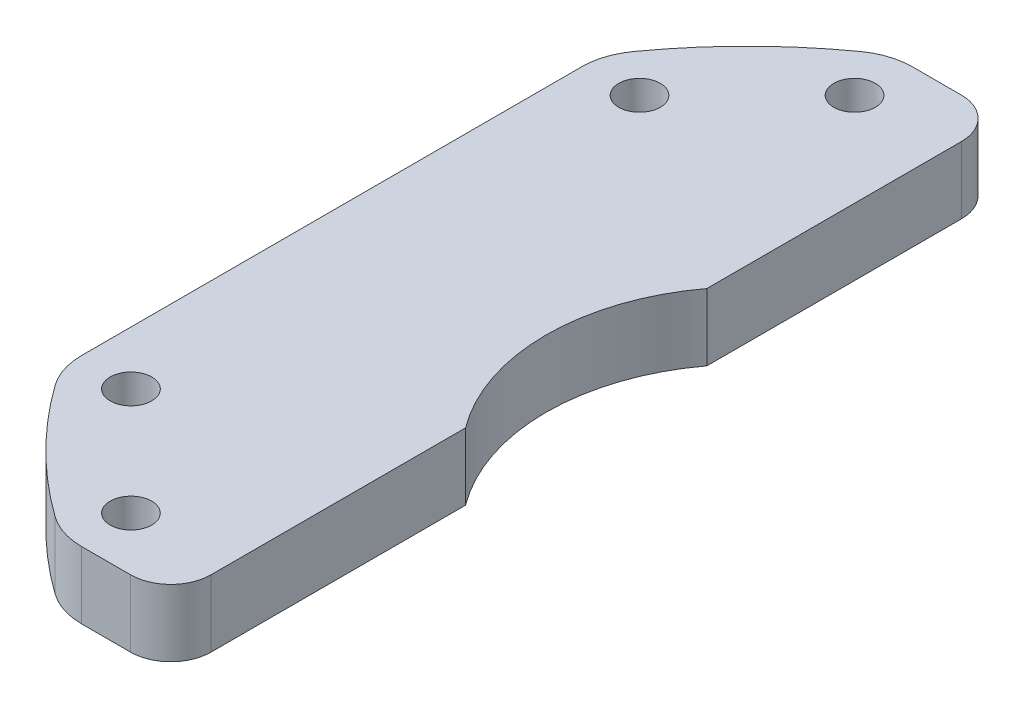
ISO-10303-21;
HEADER;
FILE_DESCRIPTION(('STEP AP214'),'2;1');
FILE_NAME('part.step','',(''),(''),'','','');
FILE_SCHEMA(('AUTOMOTIVE_DESIGN { 1 0 10303 214 1 1 1 1 }'));
ENDSEC;
DATA;
#1=APPLICATION_CONTEXT('core data for automotive mechanical design processes');
#2=APPLICATION_PROTOCOL_DEFINITION('international standard','automotive_design',2000,#1);
#3=PRODUCT_CONTEXT('',#1,'mechanical');
#4=PRODUCT('Part','Part','',(#3));
#5=PRODUCT_RELATED_PRODUCT_CATEGORY('part','',(#4));
#6=PRODUCT_DEFINITION_FORMATION('','',#4);
#7=PRODUCT_DEFINITION_CONTEXT('part definition',#1,'design');
#8=PRODUCT_DEFINITION('design','',#6,#7);
#9=PRODUCT_DEFINITION_SHAPE('','',#8);
#10=(LENGTH_UNIT() NAMED_UNIT(*) SI_UNIT(.MILLI.,.METRE.));
#11=(NAMED_UNIT(*) PLANE_ANGLE_UNIT() SI_UNIT($,.RADIAN.));
#12=(NAMED_UNIT(*) SI_UNIT($,.STERADIAN.) SOLID_ANGLE_UNIT());
#13=UNCERTAINTY_MEASURE_WITH_UNIT(LENGTH_MEASURE(1.E-05),#10,'distance_accuracy_value','');
#14=(GEOMETRIC_REPRESENTATION_CONTEXT(3) GLOBAL_UNCERTAINTY_ASSIGNED_CONTEXT((#13)) GLOBAL_UNIT_ASSIGNED_CONTEXT((#10,
#11,#12)) REPRESENTATION_CONTEXT('',''));
#15=CARTESIAN_POINT('',(0.,0.,0.));
#16=DIRECTION('',(0.,0.,1.));
#17=DIRECTION('',(1.,0.,0.));
#18=AXIS2_PLACEMENT_3D('',#15,#16,#17);
#19=CARTESIAN_POINT('',(0.,5.,0.));
#20=DIRECTION('',(0.,-1.,0.));
#21=DIRECTION('',(0.,0.,-1.));
#22=AXIS2_PLACEMENT_3D('',#19,#20,#21);
#23=CYLINDRICAL_SURFACE('',#22,37.);
#24=CARTESIAN_POINT('',(0.,0.,0.));
#25=DIRECTION('',(0.,1.,0.));
#26=DIRECTION('',(0.,0.,1.));
#27=AXIS2_PLACEMENT_3D('',#24,#25,#26);
#28=CIRCLE('',#27,37.);
#29=CARTESIAN_POINT('',(-21.5695640602679,0.,-30.0625));
#30=VERTEX_POINT('',#29);
#31=CARTESIAN_POINT('',(-30.0625,0.,-21.5695640602679));
#32=VERTEX_POINT('',#31);
#33=EDGE_CURVE('E177',#30,#32,#28,.T.);
#34=ORIENTED_EDGE('',*,*,#33,.T.);
#35=DIRECTION('',(0.,-1.,0.));
#36=VECTOR('',#35,1.);
#37=CARTESIAN_POINT('',(-30.0625,5.,-21.5695640602679));
#38=LINE('',#37,#36);
#39=CARTESIAN_POINT('',(-30.0625,5.,-21.5695640602679));
#40=VERTEX_POINT('',#39);
#41=EDGE_CURVE('E53',#32,#40,#38,.F.);
#42=ORIENTED_EDGE('',*,*,#41,.T.);
#43=CARTESIAN_POINT('',(0.,5.,0.));
#44=DIRECTION('',(0.,1.,0.));
#45=DIRECTION('',(0.,0.,1.));
#46=AXIS2_PLACEMENT_3D('',#43,#44,#45);
#47=CIRCLE('',#46,37.);
#48=CARTESIAN_POINT('',(-21.5695640602679,5.,-30.0625));
#49=VERTEX_POINT('',#48);
#50=EDGE_CURVE('E186',#49,#40,#47,.T.);
#51=ORIENTED_EDGE('',*,*,#50,.F.);
#52=DIRECTION('',(0.,-1.,0.));
#53=VECTOR('',#52,1.);
#54=CARTESIAN_POINT('',(-21.5695640602679,5.,-30.0625));
#55=LINE('',#54,#53);
#56=EDGE_CURVE('E262',#49,#30,#55,.T.);
#57=ORIENTED_EDGE('',*,*,#56,.T.);
#58=EDGE_LOOP('',(#34,#42,#51,#57));
#59=FACE_BOUND('',#58,.T.);
#60=ADVANCED_FACE('F45',(#59),#23,.T.);
#61=CARTESIAN_POINT('',(-31.,5.,-20.1990098767242));
#62=DIRECTION('',(1.,0.,0.));
#63=DIRECTION('',(0.,0.,-1.));
#64=AXIS2_PLACEMENT_3D('',#61,#62,#63);
#65=PLANE('',#64);
#66=DIRECTION('',(0.,0.,1.));
#67=VECTOR('',#66,1.);
#68=CARTESIAN_POINT('',(-31.,0.,-20.1990098767242));
#69=LINE('',#68,#67);
#70=CARTESIAN_POINT('',(-31.,0.,-18.6547581061776));
#71=VERTEX_POINT('',#70);
#72=CARTESIAN_POINT('',(-31.,0.,18.6547581061776));
#73=VERTEX_POINT('',#72);
#74=EDGE_CURVE('E200',#71,#73,#69,.T.);
#75=ORIENTED_EDGE('',*,*,#74,.T.);
#76=DIRECTION('',(0.,-1.,0.));
#77=VECTOR('',#76,1.);
#78=CARTESIAN_POINT('',(-31.,5.,18.6547581061776));
#79=LINE('',#78,#77);
#80=CARTESIAN_POINT('',(-31.,5.,18.6547581061776));
#81=VERTEX_POINT('',#80);
#82=EDGE_CURVE('E60',#73,#81,#79,.F.);
#83=ORIENTED_EDGE('',*,*,#82,.T.);
#84=DIRECTION('',(0.,0.,1.));
#85=VECTOR('',#84,1.);
#86=CARTESIAN_POINT('',(-31.,5.,-20.1990098767242));
#87=LINE('',#86,#85);
#88=CARTESIAN_POINT('',(-31.,5.,-18.6547581061776));
#89=VERTEX_POINT('',#88);
#90=EDGE_CURVE('E188',#89,#81,#87,.T.);
#91=ORIENTED_EDGE('',*,*,#90,.F.);
#92=DIRECTION('',(0.,-1.,0.));
#93=VECTOR('',#92,1.);
#94=CARTESIAN_POINT('',(-31.,5.,-18.6547581061776));
#95=LINE('',#94,#93);
#96=EDGE_CURVE('E258',#89,#71,#95,.T.);
#97=ORIENTED_EDGE('',*,*,#96,.T.);
#98=EDGE_LOOP('',(#75,#83,#91,#97));
#99=FACE_BOUND('',#98,.T.);
#100=ADVANCED_FACE('F274',(#99),#65,.F.);
#101=CARTESIAN_POINT('',(0.,5.,0.));
#102=DIRECTION('',(0.,-1.,0.));
#103=DIRECTION('',(0.,0.,-1.));
#104=AXIS2_PLACEMENT_3D('',#101,#102,#103);
#105=CYLINDRICAL_SURFACE('',#104,37.);
#106=CARTESIAN_POINT('',(0.,0.,0.));
#107=DIRECTION('',(0.,1.,0.));
#108=DIRECTION('',(0.,0.,1.));
#109=AXIS2_PLACEMENT_3D('',#106,#107,#108);
#110=CIRCLE('',#109,37.);
#111=CARTESIAN_POINT('',(-30.0625,0.,21.5695640602679));
#112=VERTEX_POINT('',#111);
#113=CARTESIAN_POINT('',(-21.5695640602679,0.,30.0625));
#114=VERTEX_POINT('',#113);
#115=EDGE_CURVE('E202',#112,#114,#110,.T.);
#116=ORIENTED_EDGE('',*,*,#115,.T.);
#117=DIRECTION('',(0.,-1.,0.));
#118=VECTOR('',#117,1.);
#119=CARTESIAN_POINT('',(-21.5695640602679,5.,30.0625));
#120=LINE('',#119,#118);
#121=CARTESIAN_POINT('',(-21.5695640602679,5.,30.0625));
#122=VERTEX_POINT('',#121);
#123=EDGE_CURVE('E249',#114,#122,#120,.F.);
#124=ORIENTED_EDGE('',*,*,#123,.T.);
#125=CARTESIAN_POINT('',(0.,5.,0.));
#126=DIRECTION('',(0.,1.,0.));
#127=DIRECTION('',(0.,0.,1.));
#128=AXIS2_PLACEMENT_3D('',#125,#126,#127);
#129=CIRCLE('',#128,37.);
#130=CARTESIAN_POINT('',(-30.0625,5.,21.5695640602679));
#131=VERTEX_POINT('',#130);
#132=EDGE_CURVE('E191',#131,#122,#129,.T.);
#133=ORIENTED_EDGE('',*,*,#132,.F.);
#134=DIRECTION('',(0.,-1.,0.));
#135=VECTOR('',#134,1.);
#136=CARTESIAN_POINT('',(-30.0625,5.,21.5695640602679));
#137=LINE('',#136,#135);
#138=EDGE_CURVE('E246',#131,#112,#137,.T.);
#139=ORIENTED_EDGE('',*,*,#138,.T.);
#140=EDGE_LOOP('',(#116,#124,#133,#139));
#141=FACE_BOUND('',#140,.T.);
#142=ADVANCED_FACE('F285',(#141),#105,.T.);
#143=CARTESIAN_POINT('',(-20.1990098767242,5.,31.));
#144=DIRECTION('',(0.,0.,-1.));
#145=DIRECTION('',(-1.,0.,0.));
#146=AXIS2_PLACEMENT_3D('',#143,#144,#145);
#147=PLANE('',#146);
#148=DIRECTION('',(1.,0.,0.));
#149=VECTOR('',#148,1.);
#150=CARTESIAN_POINT('',(-20.1990098767242,5.,31.));
#151=LINE('',#150,#149);
#152=CARTESIAN_POINT('',(-18.6547581061776,5.,31.));
#153=VERTEX_POINT('',#152);
#154=CARTESIAN_POINT('',(-15.,5.,31.));
#155=VERTEX_POINT('',#154);
#156=EDGE_CURVE('E193',#153,#155,#151,.T.);
#157=ORIENTED_EDGE('',*,*,#156,.F.);
#158=DIRECTION('',(0.,-1.,0.));
#159=VECTOR('',#158,1.);
#160=CARTESIAN_POINT('',(-18.6547581061776,5.,31.));
#161=LINE('',#160,#159);
#162=CARTESIAN_POINT('',(-18.6547581061776,0.,31.));
#163=VERTEX_POINT('',#162);
#164=EDGE_CURVE('E235',#153,#163,#161,.T.);
#165=ORIENTED_EDGE('',*,*,#164,.T.);
#166=DIRECTION('',(1.,0.,0.));
#167=VECTOR('',#166,1.);
#168=CARTESIAN_POINT('',(-20.1990098767242,0.,31.));
#169=LINE('',#168,#167);
#170=CARTESIAN_POINT('',(-15.,0.,31.));
#171=VERTEX_POINT('',#170);
#172=EDGE_CURVE('E205',#163,#171,#169,.T.);
#173=ORIENTED_EDGE('',*,*,#172,.T.);
#174=DIRECTION('',(0.,1.,0.));
#175=VECTOR('',#174,1.);
#176=CARTESIAN_POINT('',(-15.,5.,31.));
#177=LINE('',#176,#175);
#178=EDGE_CURVE('E158',#171,#155,#177,.T.);
#179=ORIENTED_EDGE('',*,*,#178,.T.);
#180=EDGE_LOOP('',(#157,#165,#173,#179));
#181=FACE_BOUND('',#180,.T.);
#182=ADVANCED_FACE('F293',(#181),#147,.F.);
#183=CARTESIAN_POINT('',(-20.1990098767241,5.,-31.));
#184=DIRECTION('',(0.,0.,1.));
#185=DIRECTION('',(1.,0.,0.));
#186=AXIS2_PLACEMENT_3D('',#183,#184,#185);
#187=PLANE('',#186);
#188=DIRECTION('',(-1.,0.,0.));
#189=VECTOR('',#188,1.);
#190=CARTESIAN_POINT('',(-20.1990098767241,0.,-31.));
#191=LINE('',#190,#189);
#192=CARTESIAN_POINT('',(-15.,0.,-31.));
#193=VERTEX_POINT('',#192);
#194=CARTESIAN_POINT('',(-18.6547581061776,0.,-31.));
#195=VERTEX_POINT('',#194);
#196=EDGE_CURVE('E189',#193,#195,#191,.T.);
#197=ORIENTED_EDGE('',*,*,#196,.T.);
#198=DIRECTION('',(0.,-1.,0.));
#199=VECTOR('',#198,1.);
#200=CARTESIAN_POINT('',(-18.6547581061776,5.,-31.));
#201=LINE('',#200,#199);
#202=CARTESIAN_POINT('',(-18.6547581061776,5.,-31.));
#203=VERTEX_POINT('',#202);
#204=EDGE_CURVE('E11',#195,#203,#201,.F.);
#205=ORIENTED_EDGE('',*,*,#204,.T.);
#206=DIRECTION('',(-1.,0.,0.));
#207=VECTOR('',#206,1.);
#208=CARTESIAN_POINT('',(-20.1990098767241,5.,-31.));
#209=LINE('',#208,#207);
#210=CARTESIAN_POINT('',(-15.,5.,-31.));
#211=VERTEX_POINT('',#210);
#212=EDGE_CURVE('E195',#211,#203,#209,.T.);
#213=ORIENTED_EDGE('',*,*,#212,.F.);
#214=DIRECTION('',(0.,-1.,0.));
#215=VECTOR('',#214,1.);
#216=CARTESIAN_POINT('',(-15.,5.,-31.));
#217=LINE('',#216,#215);
#218=EDGE_CURVE('E230',#211,#193,#217,.T.);
#219=ORIENTED_EDGE('',*,*,#218,.T.);
#220=EDGE_LOOP('',(#197,#205,#213,#219));
#221=FACE_BOUND('',#220,.T.);
#222=ADVANCED_FACE('F320',(#221),#187,.F.);
#223=CARTESIAN_POINT('',(0.,5.,0.));
#224=DIRECTION('',(0.,1.,0.));
#225=DIRECTION('',(0.,0.,1.));
#226=AXIS2_PLACEMENT_3D('',#223,#224,#225);
#227=PLANE('',#226);
#228=ORIENTED_EDGE('',*,*,#132,.T.);
#229=CARTESIAN_POINT('',(-18.6547581061776,5.,26.));
#230=DIRECTION('',(0.,1.,0.));
#231=DIRECTION('',(0.,0.,1.));
#232=AXIS2_PLACEMENT_3D('',#229,#230,#231);
#233=CIRCLE('',#232,5.);
#234=EDGE_CURVE('E256',#122,#153,#233,.T.);
#235=ORIENTED_EDGE('',*,*,#234,.T.);
#236=ORIENTED_EDGE('',*,*,#156,.T.);
#237=CARTESIAN_POINT('',(-15.,5.,28.));
#238=DIRECTION('',(0.,1.,0.));
#239=DIRECTION('',(0.,0.,1.));
#240=AXIS2_PLACEMENT_3D('',#237,#238,#239);
#241=CIRCLE('',#240,3.);
#242=CARTESIAN_POINT('',(-12.,5.,28.));
#243=VERTEX_POINT('',#242);
#244=EDGE_CURVE('E168',#155,#243,#241,.T.);
#245=ORIENTED_EDGE('',*,*,#244,.T.);
#246=DIRECTION('',(0.,0.,1.));
#247=VECTOR('',#246,1.);
#248=CARTESIAN_POINT('',(-12.,5.,-48.9310275070538));
#249=LINE('',#248,#247);
#250=CARTESIAN_POINT('',(-12.,5.,9.00000000000001));
#251=VERTEX_POINT('',#250);
#252=EDGE_CURVE('E150',#251,#243,#249,.T.);
#253=ORIENTED_EDGE('',*,*,#252,.F.);
#254=CARTESIAN_POINT('',(0.,5.,0.));
#255=DIRECTION('',(0.,1.,0.));
#256=DIRECTION('',(0.,0.,1.));
#257=AXIS2_PLACEMENT_3D('',#254,#255,#256);
#258=CIRCLE('',#257,15.);
#259=CARTESIAN_POINT('',(-12.,5.,-9.00000000000001));
#260=VERTEX_POINT('',#259);
#261=EDGE_CURVE('E166',#260,#251,#258,.T.);
#262=ORIENTED_EDGE('',*,*,#261,.F.);
#263=CARTESIAN_POINT('',(-12.,5.,-28.));
#264=VERTEX_POINT('',#263);
#265=EDGE_CURVE('E169',#264,#260,#249,.T.);
#266=ORIENTED_EDGE('',*,*,#265,.F.);
#267=CARTESIAN_POINT('',(-15.,5.,-28.));
#268=DIRECTION('',(0.,1.,0.));
#269=DIRECTION('',(0.,0.,1.));
#270=AXIS2_PLACEMENT_3D('',#267,#268,#269);
#271=CIRCLE('',#270,3.);
#272=EDGE_CURVE('E220',#264,#211,#271,.T.);
#273=ORIENTED_EDGE('',*,*,#272,.T.);
#274=ORIENTED_EDGE('',*,*,#212,.T.);
#275=CARTESIAN_POINT('',(-18.6547581061776,5.,-26.));
#276=DIRECTION('',(0.,1.,0.));
#277=DIRECTION('',(0.,0.,1.));
#278=AXIS2_PLACEMENT_3D('',#275,#276,#277);
#279=CIRCLE('',#278,5.);
#280=EDGE_CURVE('E251',#203,#49,#279,.T.);
#281=ORIENTED_EDGE('',*,*,#280,.T.);
#282=ORIENTED_EDGE('',*,*,#50,.T.);
#283=CARTESIAN_POINT('',(-26.,5.,-18.6547581061776));
#284=DIRECTION('',(0.,1.,0.));
#285=DIRECTION('',(0.,0.,1.));
#286=AXIS2_PLACEMENT_3D('',#283,#284,#285);
#287=CIRCLE('',#286,5.);
#288=EDGE_CURVE('E67',#40,#89,#287,.T.);
#289=ORIENTED_EDGE('',*,*,#288,.T.);
#290=ORIENTED_EDGE('',*,*,#90,.T.);
#291=CARTESIAN_POINT('',(-26.,5.,18.6547581061776));
#292=DIRECTION('',(0.,1.,0.));
#293=DIRECTION('',(0.,0.,1.));
#294=AXIS2_PLACEMENT_3D('',#291,#292,#293);
#295=CIRCLE('',#294,5.);
#296=EDGE_CURVE('E254',#81,#131,#295,.T.);
#297=ORIENTED_EDGE('',*,*,#296,.T.);
#298=EDGE_LOOP('',(#228,#235,#236,#245,#253,#262,#266,#273,#274,#281,#282,#289,#290,#297));
#299=FACE_BOUND('',#298,.T.);
#300=CARTESIAN_POINT('',(-18.9751733174279,5.,-26.9989406750259));
#301=DIRECTION('',(0.,1.,0.));
#302=DIRECTION('',(0.,0.,-1.));
#303=AXIS2_PLACEMENT_3D('',#300,#301,#302);
#304=CIRCLE('',#303,1.55);
#305=CARTESIAN_POINT('',(-18.9751733174279,5.,-28.5489406750259));
#306=VERTEX_POINT('',#305);
#307=EDGE_CURVE('E364',#306,#306,#304,.T.);
#308=ORIENTED_EDGE('',*,*,#307,.F.);
#309=EDGE_LOOP('',(#308));
#310=FACE_BOUND('',#309,.T.);
#311=CARTESIAN_POINT('',(-18.9751733174279,5.,26.998940675026));
#312=DIRECTION('',(0.,1.,0.));
#313=DIRECTION('',(0.,0.,1.));
#314=AXIS2_PLACEMENT_3D('',#311,#312,#313);
#315=CIRCLE('',#314,1.55);
#316=CARTESIAN_POINT('',(-18.9751733174279,5.,28.548940675026));
#317=VERTEX_POINT('',#316);
#318=EDGE_CURVE('E351',#317,#317,#315,.T.);
#319=ORIENTED_EDGE('',*,*,#318,.F.);
#320=EDGE_LOOP('',(#319));
#321=FACE_BOUND('',#320,.T.);
#322=CARTESIAN_POINT('',(-26.9989406750259,5.,18.975173317428));
#323=DIRECTION('',(0.,1.,0.));
#324=DIRECTION('',(0.,0.,-1.));
#325=AXIS2_PLACEMENT_3D('',#322,#323,#324);
#326=CIRCLE('',#325,1.55);
#327=CARTESIAN_POINT('',(-26.9989406750259,5.,17.425173317428));
#328=VERTEX_POINT('',#327);
#329=EDGE_CURVE('E361',#328,#328,#326,.T.);
#330=ORIENTED_EDGE('',*,*,#329,.F.);
#331=EDGE_LOOP('',(#330));
#332=FACE_BOUND('',#331,.T.);
#333=CARTESIAN_POINT('',(-26.9989406750259,5.,-18.975173317428));
#334=DIRECTION('',(0.,1.,0.));
#335=DIRECTION('',(0.,0.,1.));
#336=AXIS2_PLACEMENT_3D('',#333,#334,#335);
#337=CIRCLE('',#336,1.55);
#338=CARTESIAN_POINT('',(-26.9989406750259,5.,-17.425173317428));
#339=VERTEX_POINT('',#338);
#340=EDGE_CURVE('E184',#339,#339,#337,.T.);
#341=ORIENTED_EDGE('',*,*,#340,.F.);
#342=EDGE_LOOP('',(#341));
#343=FACE_BOUND('',#342,.T.);
#344=ADVANCED_FACE('F163',(#299,#310,#321,#332,#343),#227,.T.);
#345=CARTESIAN_POINT('',(0.,0.,0.));
#346=DIRECTION('',(0.,1.,0.));
#347=DIRECTION('',(0.,0.,1.));
#348=AXIS2_PLACEMENT_3D('',#345,#346,#347);
#349=PLANE('',#348);
#350=CARTESIAN_POINT('',(-18.9751733174279,0.,-26.9989406750259));
#351=DIRECTION('',(0.,1.,0.));
#352=DIRECTION('',(0.,0.,1.));
#353=AXIS2_PLACEMENT_3D('',#350,#351,#352);
#354=CIRCLE('',#353,1.55);
#355=CARTESIAN_POINT('',(-18.9751733174279,0.,-25.448940675026));
#356=VERTEX_POINT('',#355);
#357=EDGE_CURVE('E175',#356,#356,#354,.T.);
#358=ORIENTED_EDGE('',*,*,#357,.T.);
#359=EDGE_LOOP('',(#358));
#360=FACE_BOUND('',#359,.T.);
#361=CARTESIAN_POINT('',(-18.9751733174279,0.,26.998940675026));
#362=DIRECTION('',(0.,1.,0.));
#363=DIRECTION('',(0.,0.,1.));
#364=AXIS2_PLACEMENT_3D('',#361,#362,#363);
#365=CIRCLE('',#364,1.55);
#366=CARTESIAN_POINT('',(-18.9751733174279,0.,28.548940675026));
#367=VERTEX_POINT('',#366);
#368=EDGE_CURVE('E180',#367,#367,#365,.T.);
#369=ORIENTED_EDGE('',*,*,#368,.T.);
#370=EDGE_LOOP('',(#369));
#371=FACE_BOUND('',#370,.T.);
#372=CARTESIAN_POINT('',(-26.9989406750259,0.,18.975173317428));
#373=DIRECTION('',(0.,1.,0.));
#374=DIRECTION('',(0.,0.,1.));
#375=AXIS2_PLACEMENT_3D('',#372,#373,#374);
#376=CIRCLE('',#375,1.55);
#377=CARTESIAN_POINT('',(-26.9989406750259,0.,20.525173317428));
#378=VERTEX_POINT('',#377);
#379=EDGE_CURVE('E212',#378,#378,#376,.T.);
#380=ORIENTED_EDGE('',*,*,#379,.T.);
#381=EDGE_LOOP('',(#380));
#382=FACE_BOUND('',#381,.T.);
#383=CARTESIAN_POINT('',(-26.9989406750259,0.,-18.975173317428));
#384=DIRECTION('',(0.,1.,0.));
#385=DIRECTION('',(0.,0.,1.));
#386=AXIS2_PLACEMENT_3D('',#383,#384,#385);
#387=CIRCLE('',#386,1.55);
#388=CARTESIAN_POINT('',(-26.9989406750259,0.,-17.425173317428));
#389=VERTEX_POINT('',#388);
#390=EDGE_CURVE('E209',#389,#389,#387,.T.);
#391=ORIENTED_EDGE('',*,*,#390,.T.);
#392=EDGE_LOOP('',(#391));
#393=FACE_BOUND('',#392,.T.);
#394=ORIENTED_EDGE('',*,*,#172,.F.);
#395=CARTESIAN_POINT('',(-18.6547581061776,0.,26.));
#396=DIRECTION('',(0.,1.,0.));
#397=DIRECTION('',(0.,0.,1.));
#398=AXIS2_PLACEMENT_3D('',#395,#396,#397);
#399=CIRCLE('',#398,5.);
#400=EDGE_CURVE('E244',#163,#114,#399,.F.);
#401=ORIENTED_EDGE('',*,*,#400,.T.);
#402=ORIENTED_EDGE('',*,*,#115,.F.);
#403=CARTESIAN_POINT('',(-26.,0.,18.6547581061776));
#404=DIRECTION('',(0.,1.,0.));
#405=DIRECTION('',(0.,0.,1.));
#406=AXIS2_PLACEMENT_3D('',#403,#404,#405);
#407=CIRCLE('',#406,5.);
#408=EDGE_CURVE('E242',#112,#73,#407,.F.);
#409=ORIENTED_EDGE('',*,*,#408,.T.);
#410=ORIENTED_EDGE('',*,*,#74,.F.);
#411=CARTESIAN_POINT('',(-26.,0.,-18.6547581061776));
#412=DIRECTION('',(0.,1.,0.));
#413=DIRECTION('',(0.,0.,1.));
#414=AXIS2_PLACEMENT_3D('',#411,#412,#413);
#415=CIRCLE('',#414,5.);
#416=EDGE_CURVE('E240',#71,#32,#415,.F.);
#417=ORIENTED_EDGE('',*,*,#416,.T.);
#418=ORIENTED_EDGE('',*,*,#33,.F.);
#419=CARTESIAN_POINT('',(-18.6547581061776,0.,-26.));
#420=DIRECTION('',(0.,1.,0.));
#421=DIRECTION('',(0.,0.,1.));
#422=AXIS2_PLACEMENT_3D('',#419,#420,#421);
#423=CIRCLE('',#422,5.);
#424=EDGE_CURVE('E238',#30,#195,#423,.F.);
#425=ORIENTED_EDGE('',*,*,#424,.T.);
#426=ORIENTED_EDGE('',*,*,#196,.F.);
#427=CARTESIAN_POINT('',(-15.,0.,-28.));
#428=DIRECTION('',(0.,1.,0.));
#429=DIRECTION('',(0.,0.,1.));
#430=AXIS2_PLACEMENT_3D('',#427,#428,#429);
#431=CIRCLE('',#430,3.);
#432=CARTESIAN_POINT('',(-12.,0.,-28.));
#433=VERTEX_POINT('',#432);
#434=EDGE_CURVE('E225',#193,#433,#431,.F.);
#435=ORIENTED_EDGE('',*,*,#434,.T.);
#436=DIRECTION('',(0.,0.,1.));
#437=VECTOR('',#436,1.);
#438=CARTESIAN_POINT('',(-12.,0.,0.));
#439=LINE('',#438,#437);
#440=CARTESIAN_POINT('',(-12.,0.,-9.00000000000001));
#441=VERTEX_POINT('',#440);
#442=EDGE_CURVE('E366',#433,#441,#439,.T.);
#443=ORIENTED_EDGE('',*,*,#442,.T.);
#444=CARTESIAN_POINT('',(0.,0.,0.));
#445=DIRECTION('',(0.,1.,0.));
#446=DIRECTION('',(0.,0.,1.));
#447=AXIS2_PLACEMENT_3D('',#444,#445,#446);
#448=CIRCLE('',#447,15.);
#449=CARTESIAN_POINT('',(-12.,0.,9.00000000000001));
#450=VERTEX_POINT('',#449);
#451=EDGE_CURVE('E174',#441,#450,#448,.T.);
#452=ORIENTED_EDGE('',*,*,#451,.T.);
#453=CARTESIAN_POINT('',(-12.,0.,28.));
#454=VERTEX_POINT('',#453);
#455=EDGE_CURVE('E153',#450,#454,#439,.T.);
#456=ORIENTED_EDGE('',*,*,#455,.T.);
#457=CARTESIAN_POINT('',(-15.,0.,28.));
#458=DIRECTION('',(0.,1.,0.));
#459=DIRECTION('',(0.,0.,1.));
#460=AXIS2_PLACEMENT_3D('',#457,#458,#459);
#461=CIRCLE('',#460,3.);
#462=EDGE_CURVE('E227',#454,#171,#461,.F.);
#463=ORIENTED_EDGE('',*,*,#462,.T.);
#464=EDGE_LOOP('',(#394,#401,#402,#409,#410,#417,#418,#425,#426,#435,#443,#452,#456,#463));
#465=FACE_BOUND('',#464,.T.);
#466=ADVANCED_FACE('F277',(#360,#371,#382,#393,#465),#349,.F.);
#467=CARTESIAN_POINT('',(0.,-5.,0.));
#468=DIRECTION('',(0.,1.,0.));
#469=DIRECTION('',(0.,0.,1.));
#470=AXIS2_PLACEMENT_3D('',#467,#468,#469);
#471=CYLINDRICAL_SURFACE('',#470,15.);
#472=ORIENTED_EDGE('',*,*,#261,.T.);
#473=DIRECTION('',(0.,1.,0.));
#474=VECTOR('',#473,1.);
#475=CARTESIAN_POINT('',(-12.,-5.,9.00000000000001));
#476=LINE('',#475,#474);
#477=EDGE_CURVE('E147',#251,#450,#476,.F.);
#478=ORIENTED_EDGE('',*,*,#477,.T.);
#479=ORIENTED_EDGE('',*,*,#451,.F.);
#480=DIRECTION('',(0.,1.,0.));
#481=VECTOR('',#480,1.);
#482=CARTESIAN_POINT('',(-12.,-5.,-9.00000000000001));
#483=LINE('',#482,#481);
#484=EDGE_CURVE('E159',#441,#260,#483,.T.);
#485=ORIENTED_EDGE('',*,*,#484,.T.);
#486=EDGE_LOOP('',(#472,#478,#479,#485));
#487=FACE_BOUND('',#486,.T.);
#488=ADVANCED_FACE('F172',(#487),#471,.F.);
#489=CARTESIAN_POINT('',(-26.9989406750259,-5.,-18.975173317428));
#490=DIRECTION('',(0.,1.,0.));
#491=DIRECTION('',(0.,0.,1.));
#492=AXIS2_PLACEMENT_3D('',#489,#490,#491);
#493=CYLINDRICAL_SURFACE('',#492,1.55);
#494=ORIENTED_EDGE('',*,*,#340,.T.);
#495=EDGE_LOOP('',(#494));
#496=FACE_BOUND('',#495,.T.);
#497=ORIENTED_EDGE('',*,*,#390,.F.);
#498=EDGE_LOOP('',(#497));
#499=FACE_BOUND('',#498,.T.);
#500=ADVANCED_FACE('F331',(#496,#499),#493,.F.);
#501=CARTESIAN_POINT('',(-26.9989406750259,-5.,18.975173317428));
#502=DIRECTION('',(0.,1.,0.));
#503=DIRECTION('',(0.,0.,1.));
#504=AXIS2_PLACEMENT_3D('',#501,#502,#503);
#505=CYLINDRICAL_SURFACE('',#504,1.55);
#506=ORIENTED_EDGE('',*,*,#329,.T.);
#507=EDGE_LOOP('',(#506));
#508=FACE_BOUND('',#507,.T.);
#509=ORIENTED_EDGE('',*,*,#379,.F.);
#510=EDGE_LOOP('',(#509));
#511=FACE_BOUND('',#510,.T.);
#512=ADVANCED_FACE('F334',(#508,#511),#505,.F.);
#513=CARTESIAN_POINT('',(-18.9751733174279,-5.,26.998940675026));
#514=DIRECTION('',(0.,1.,0.));
#515=DIRECTION('',(0.,0.,1.));
#516=AXIS2_PLACEMENT_3D('',#513,#514,#515);
#517=CYLINDRICAL_SURFACE('',#516,1.55);
#518=ORIENTED_EDGE('',*,*,#318,.T.);
#519=EDGE_LOOP('',(#518));
#520=FACE_BOUND('',#519,.T.);
#521=ORIENTED_EDGE('',*,*,#368,.F.);
#522=EDGE_LOOP('',(#521));
#523=FACE_BOUND('',#522,.T.);
#524=ADVANCED_FACE('F339',(#520,#523),#517,.F.);
#525=CARTESIAN_POINT('',(-18.9751733174279,-5.,-26.9989406750259));
#526=DIRECTION('',(0.,1.,0.));
#527=DIRECTION('',(0.,0.,1.));
#528=AXIS2_PLACEMENT_3D('',#525,#526,#527);
#529=CYLINDRICAL_SURFACE('',#528,1.55);
#530=ORIENTED_EDGE('',*,*,#307,.T.);
#531=EDGE_LOOP('',(#530));
#532=FACE_BOUND('',#531,.T.);
#533=ORIENTED_EDGE('',*,*,#357,.F.);
#534=EDGE_LOOP('',(#533));
#535=FACE_BOUND('',#534,.T.);
#536=ADVANCED_FACE('F336',(#532,#535),#529,.F.);
#537=CARTESIAN_POINT('',(-12.,-5.,-48.9310275070538));
#538=DIRECTION('',(-1.,0.,0.));
#539=DIRECTION('',(0.,0.,1.));
#540=AXIS2_PLACEMENT_3D('',#537,#538,#539);
#541=PLANE('',#540);
#542=ORIENTED_EDGE('',*,*,#442,.F.);
#543=DIRECTION('',(0.,-1.,0.));
#544=VECTOR('',#543,1.);
#545=CARTESIAN_POINT('',(-12.,-5.,-28.));
#546=LINE('',#545,#544);
#547=EDGE_CURVE('E233',#433,#264,#546,.F.);
#548=ORIENTED_EDGE('',*,*,#547,.T.);
#549=ORIENTED_EDGE('',*,*,#265,.T.);
#550=ORIENTED_EDGE('',*,*,#484,.F.);
#551=EDGE_LOOP('',(#542,#548,#549,#550));
#552=FACE_BOUND('',#551,.T.);
#553=ADVANCED_FACE('F307',(#552),#541,.F.);
#554=ORIENTED_EDGE('',*,*,#252,.T.);
#555=DIRECTION('',(0.,1.,0.));
#556=VECTOR('',#555,1.);
#557=CARTESIAN_POINT('',(-12.,-5.,28.));
#558=LINE('',#557,#556);
#559=EDGE_CURVE('E223',#243,#454,#558,.F.);
#560=ORIENTED_EDGE('',*,*,#559,.T.);
#561=ORIENTED_EDGE('',*,*,#455,.F.);
#562=ORIENTED_EDGE('',*,*,#477,.F.);
#563=EDGE_LOOP('',(#554,#560,#561,#562));
#564=FACE_BOUND('',#563,.T.);
#565=ADVANCED_FACE('F149',(#564),#541,.F.);
#566=CARTESIAN_POINT('',(-15.,5.,28.));
#567=DIRECTION('',(0.,1.,0.));
#568=DIRECTION('',(0.,0.,1.));
#569=AXIS2_PLACEMENT_3D('',#566,#567,#568);
#570=CYLINDRICAL_SURFACE('',#569,3.);
#571=ORIENTED_EDGE('',*,*,#462,.F.);
#572=ORIENTED_EDGE('',*,*,#559,.F.);
#573=ORIENTED_EDGE('',*,*,#244,.F.);
#574=ORIENTED_EDGE('',*,*,#178,.F.);
#575=EDGE_LOOP('',(#571,#572,#573,#574));
#576=FACE_BOUND('',#575,.T.);
#577=ADVANCED_FACE('F297',(#576),#570,.T.);
#578=CARTESIAN_POINT('',(-15.,5.,-28.));
#579=DIRECTION('',(0.,-1.,0.));
#580=DIRECTION('',(0.,0.,-1.));
#581=AXIS2_PLACEMENT_3D('',#578,#579,#580);
#582=CYLINDRICAL_SURFACE('',#581,3.);
#583=ORIENTED_EDGE('',*,*,#272,.F.);
#584=ORIENTED_EDGE('',*,*,#547,.F.);
#585=ORIENTED_EDGE('',*,*,#434,.F.);
#586=ORIENTED_EDGE('',*,*,#218,.F.);
#587=EDGE_LOOP('',(#583,#584,#585,#586));
#588=FACE_BOUND('',#587,.T.);
#589=ADVANCED_FACE('F299',(#588),#582,.T.);
#590=CARTESIAN_POINT('',(-18.6547581061776,5.,26.));
#591=DIRECTION('',(0.,-1.,0.));
#592=DIRECTION('',(0.,0.,-1.));
#593=AXIS2_PLACEMENT_3D('',#590,#591,#592);
#594=CYLINDRICAL_SURFACE('',#593,5.);
#595=ORIENTED_EDGE('',*,*,#234,.F.);
#596=ORIENTED_EDGE('',*,*,#123,.F.);
#597=ORIENTED_EDGE('',*,*,#400,.F.);
#598=ORIENTED_EDGE('',*,*,#164,.F.);
#599=EDGE_LOOP('',(#595,#596,#597,#598));
#600=FACE_BOUND('',#599,.T.);
#601=ADVANCED_FACE('F291',(#600),#594,.T.);
#602=CARTESIAN_POINT('',(-26.,5.,18.6547581061776));
#603=DIRECTION('',(0.,-1.,0.));
#604=DIRECTION('',(0.,0.,-1.));
#605=AXIS2_PLACEMENT_3D('',#602,#603,#604);
#606=CYLINDRICAL_SURFACE('',#605,5.);
#607=ORIENTED_EDGE('',*,*,#296,.F.);
#608=ORIENTED_EDGE('',*,*,#82,.F.);
#609=ORIENTED_EDGE('',*,*,#408,.F.);
#610=ORIENTED_EDGE('',*,*,#138,.F.);
#611=EDGE_LOOP('',(#607,#608,#609,#610));
#612=FACE_BOUND('',#611,.T.);
#613=ADVANCED_FACE('F282',(#612),#606,.T.);
#614=CARTESIAN_POINT('',(-26.,5.,-18.6547581061776));
#615=DIRECTION('',(0.,-1.,0.));
#616=DIRECTION('',(0.,0.,-1.));
#617=AXIS2_PLACEMENT_3D('',#614,#615,#616);
#618=CYLINDRICAL_SURFACE('',#617,5.);
#619=ORIENTED_EDGE('',*,*,#288,.F.);
#620=ORIENTED_EDGE('',*,*,#41,.F.);
#621=ORIENTED_EDGE('',*,*,#416,.F.);
#622=ORIENTED_EDGE('',*,*,#96,.F.);
#623=EDGE_LOOP('',(#619,#620,#621,#622));
#624=FACE_BOUND('',#623,.T.);
#625=ADVANCED_FACE('F272',(#624),#618,.T.);
#626=CARTESIAN_POINT('',(-18.6547581061776,5.,-26.));
#627=DIRECTION('',(0.,-1.,0.));
#628=DIRECTION('',(0.,0.,-1.));
#629=AXIS2_PLACEMENT_3D('',#626,#627,#628);
#630=CYLINDRICAL_SURFACE('',#629,5.);
#631=ORIENTED_EDGE('',*,*,#280,.F.);
#632=ORIENTED_EDGE('',*,*,#204,.F.);
#633=ORIENTED_EDGE('',*,*,#424,.F.);
#634=ORIENTED_EDGE('',*,*,#56,.F.);
#635=EDGE_LOOP('',(#631,#632,#633,#634));
#636=FACE_BOUND('',#635,.T.);
#637=ADVANCED_FACE('F47',(#636),#630,.T.);
#638=CLOSED_SHELL('',(#60,#100,#142,#182,#222,#344,#466,#488,#500,#512,#524,#536,#553,#565,#577,
#589,#601,#613,#625,#637));
#639=MANIFOLD_SOLID_BREP('B2',#638);
#640=ADVANCED_BREP_SHAPE_REPRESENTATION('',(#18,#639),#14);
#641=SHAPE_DEFINITION_REPRESENTATION(#9,#640);
ENDSEC;
END-ISO-10303-21;
